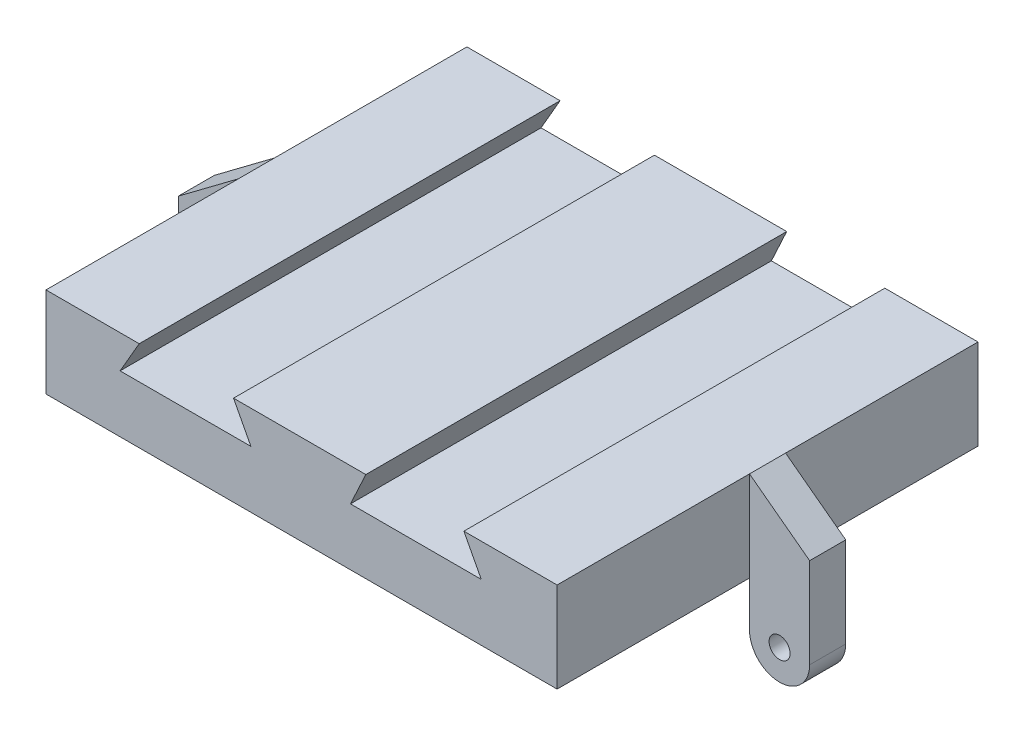
ISO-10303-21;
HEADER;
FILE_DESCRIPTION(('STEP AP214'),'2;1');
FILE_NAME('part.step','',(''),(''),'','','');
FILE_SCHEMA(('AUTOMOTIVE_DESIGN { 1 0 10303 214 1 1 1 1 }'));
ENDSEC;
DATA;
#1=APPLICATION_CONTEXT('core data for automotive mechanical design processes');
#2=APPLICATION_PROTOCOL_DEFINITION('international standard','automotive_design',2000,#1);
#3=PRODUCT_CONTEXT('',#1,'mechanical');
#4=PRODUCT('Part','Part','',(#3));
#5=PRODUCT_RELATED_PRODUCT_CATEGORY('part','',(#4));
#6=PRODUCT_DEFINITION_FORMATION('','',#4);
#7=PRODUCT_DEFINITION_CONTEXT('part definition',#1,'design');
#8=PRODUCT_DEFINITION('design','',#6,#7);
#9=PRODUCT_DEFINITION_SHAPE('','',#8);
#10=(LENGTH_UNIT() NAMED_UNIT(*) SI_UNIT(.MILLI.,.METRE.));
#11=(NAMED_UNIT(*) PLANE_ANGLE_UNIT() SI_UNIT($,.RADIAN.));
#12=(NAMED_UNIT(*) SI_UNIT($,.STERADIAN.) SOLID_ANGLE_UNIT());
#13=UNCERTAINTY_MEASURE_WITH_UNIT(LENGTH_MEASURE(1.E-05),#10,'distance_accuracy_value','');
#14=(GEOMETRIC_REPRESENTATION_CONTEXT(3) GLOBAL_UNCERTAINTY_ASSIGNED_CONTEXT((#13)) GLOBAL_UNIT_ASSIGNED_CONTEXT((#10,
#11,#12)) REPRESENTATION_CONTEXT('',''));
#15=CARTESIAN_POINT('',(0.,0.,0.));
#16=DIRECTION('',(0.,0.,1.));
#17=DIRECTION('',(1.,0.,0.));
#18=AXIS2_PLACEMENT_3D('',#15,#16,#17);
#19=CARTESIAN_POINT('',(49.41616422386,-1.305310773114,38.));
#20=DIRECTION('',(1.,0.,0.));
#21=DIRECTION('',(0.,0.,-1.));
#22=AXIS2_PLACEMENT_3D('',#19,#20,#21);
#23=PLANE('',#22);
#24=DIRECTION('',(0.,1.,0.));
#25=VECTOR('',#24,1.);
#26=CARTESIAN_POINT('',(49.41616422386,-16.30531077311,38.));
#27=LINE('',#26,#25);
#28=CARTESIAN_POINT('',(49.41616422386,-1.305310773114,38.));
#29=VERTEX_POINT('',#28);
#30=CARTESIAN_POINT('',(49.41616422386,-16.30531077311,38.));
#31=VERTEX_POINT('',#30);
#32=EDGE_CURVE('E119',#29,#31,#27,.F.);
#33=ORIENTED_EDGE('',*,*,#32,.T.);
#34=DIRECTION('',(0.,0.,-1.));
#35=VECTOR('',#34,1.);
#36=CARTESIAN_POINT('',(49.41616422386,-16.30531077311,38.));
#37=LINE('',#36,#35);
#38=CARTESIAN_POINT('',(49.41616422386,-16.30531077311,32.));
#39=VERTEX_POINT('',#38);
#40=EDGE_CURVE('E104',#39,#31,#37,.F.);
#41=ORIENTED_EDGE('',*,*,#40,.F.);
#42=DIRECTION('',(0.,1.,0.));
#43=VECTOR('',#42,1.);
#44=CARTESIAN_POINT('',(49.41616422386,-16.30531077311,32.));
#45=LINE('',#44,#43);
#46=CARTESIAN_POINT('',(49.41616422386,-1.305310773114,32.));
#47=VERTEX_POINT('',#46);
#48=EDGE_CURVE('E211',#47,#39,#45,.F.);
#49=ORIENTED_EDGE('',*,*,#48,.F.);
#50=DIRECTION('',(0.,0.,1.));
#51=VECTOR('',#50,1.);
#52=CARTESIAN_POINT('',(49.41616422386,-1.305310773114,38.));
#53=LINE('',#52,#51);
#54=EDGE_CURVE('E124',#29,#47,#53,.F.);
#55=ORIENTED_EDGE('',*,*,#54,.F.);
#56=EDGE_LOOP('',(#33,#41,#49,#55));
#57=FACE_BOUND('',#56,.T.);
#58=ADVANCED_FACE('F15',(#57),#23,.T.);
#59=CARTESIAN_POINT('',(44.41616422386,-16.30531077311,38.));
#60=DIRECTION('',(0.,0.,-1.));
#61=DIRECTION('',(-1.,0.,0.));
#62=AXIS2_PLACEMENT_3D('',#59,#60,#61);
#63=CYLINDRICAL_SURFACE('',#62,1.75);
#64=CARTESIAN_POINT('',(44.41616422386,-16.30531077311,32.));
#65=DIRECTION('',(0.,0.,-1.));
#66=DIRECTION('',(-1.,0.,0.));
#67=AXIS2_PLACEMENT_3D('',#64,#65,#66);
#68=CIRCLE('',#67,1.75);
#69=CARTESIAN_POINT('',(42.66616422386,-16.30531077311,32.));
#70=VERTEX_POINT('',#69);
#71=EDGE_CURVE('E255',#70,#70,#68,.F.);
#72=ORIENTED_EDGE('',*,*,#71,.F.);
#73=EDGE_LOOP('',(#72));
#74=FACE_BOUND('',#73,.T.);
#75=CARTESIAN_POINT('',(44.41616422386,-16.30531077311,38.));
#76=DIRECTION('',(0.,0.,-1.));
#77=DIRECTION('',(-1.,0.,0.));
#78=AXIS2_PLACEMENT_3D('',#75,#76,#77);
#79=CIRCLE('',#78,1.75);
#80=CARTESIAN_POINT('',(42.66616422386,-16.30531077311,38.));
#81=VERTEX_POINT('',#80);
#82=EDGE_CURVE('E123',#81,#81,#79,.F.);
#83=ORIENTED_EDGE('',*,*,#82,.T.);
#84=EDGE_LOOP('',(#83));
#85=FACE_BOUND('',#84,.T.);
#86=ADVANCED_FACE('F262',(#74,#85),#63,.F.);
#87=CARTESIAN_POINT('',(49.41616422386,-1.305310773114,38.));
#88=DIRECTION('',(0.6,0.8,0.));
#89=DIRECTION('',(-0.8,0.6,0.));
#90=AXIS2_PLACEMENT_3D('',#87,#88,#89);
#91=PLANE('',#90);
#92=DIRECTION('',(0.800000000000038,-0.599999999999949,0.));
#93=VECTOR('',#92,1.);
#94=CARTESIAN_POINT('',(39.41616422386,6.194689226885,32.));
#95=LINE('',#94,#93);
#96=CARTESIAN_POINT('',(39.41616422386,6.194689226885,32.));
#97=VERTEX_POINT('',#96);
#98=EDGE_CURVE('E208',#97,#47,#95,.T.);
#99=ORIENTED_EDGE('',*,*,#98,.F.);
#100=DIRECTION('',(0.,0.,-1.));
#101=VECTOR('',#100,1.);
#102=CARTESIAN_POINT('',(39.41616422386,6.194689226885,70.));
#103=LINE('',#102,#101);
#104=CARTESIAN_POINT('',(39.41616422386,6.194689226885,38.));
#105=VERTEX_POINT('',#104);
#106=EDGE_CURVE('E176',#97,#105,#103,.F.);
#107=ORIENTED_EDGE('',*,*,#106,.T.);
#108=DIRECTION('',(0.800000000000038,-0.599999999999949,0.));
#109=VECTOR('',#108,1.);
#110=CARTESIAN_POINT('',(39.41616422386,6.194689226885,38.));
#111=LINE('',#110,#109);
#112=EDGE_CURVE('E113',#105,#29,#111,.T.);
#113=ORIENTED_EDGE('',*,*,#112,.T.);
#114=ORIENTED_EDGE('',*,*,#54,.T.);
#115=EDGE_LOOP('',(#99,#107,#113,#114));
#116=FACE_BOUND('',#115,.T.);
#117=ADVANCED_FACE('F499',(#116),#91,.T.);
#118=CARTESIAN_POINT('',(-55.58383577614,-1.305310773114,38.));
#119=DIRECTION('',(-1.,0.,0.));
#120=DIRECTION('',(0.,0.,1.));
#121=AXIS2_PLACEMENT_3D('',#118,#119,#120);
#122=PLANE('',#121);
#123=DIRECTION('',(0.,1.,0.));
#124=VECTOR('',#123,1.);
#125=CARTESIAN_POINT('',(-55.58383577614,-16.30531077311,38.));
#126=LINE('',#125,#124);
#127=CARTESIAN_POINT('',(-55.58383577614,-16.30531077311,38.));
#128=VERTEX_POINT('',#127);
#129=CARTESIAN_POINT('',(-55.58383577614,-1.305310773114,38.));
#130=VERTEX_POINT('',#129);
#131=EDGE_CURVE('E191',#128,#130,#126,.T.);
#132=ORIENTED_EDGE('',*,*,#131,.T.);
#133=DIRECTION('',(0.,0.,1.));
#134=VECTOR('',#133,1.);
#135=CARTESIAN_POINT('',(-55.58383577614,-1.305310773114,38.));
#136=LINE('',#135,#134);
#137=CARTESIAN_POINT('',(-55.58383577614,-1.305310773114,32.));
#138=VERTEX_POINT('',#137);
#139=EDGE_CURVE('E114',#138,#130,#136,.T.);
#140=ORIENTED_EDGE('',*,*,#139,.F.);
#141=DIRECTION('',(0.,1.,0.));
#142=VECTOR('',#141,1.);
#143=CARTESIAN_POINT('',(-55.58383577614,-16.30531077311,32.));
#144=LINE('',#143,#142);
#145=CARTESIAN_POINT('',(-55.58383577614,-16.30531077311,32.));
#146=VERTEX_POINT('',#145);
#147=EDGE_CURVE('E250',#146,#138,#144,.T.);
#148=ORIENTED_EDGE('',*,*,#147,.F.);
#149=DIRECTION('',(0.,0.,-1.));
#150=VECTOR('',#149,1.);
#151=CARTESIAN_POINT('',(-55.58383577614,-16.30531077311,38.));
#152=LINE('',#151,#150);
#153=EDGE_CURVE('E204',#128,#146,#152,.T.);
#154=ORIENTED_EDGE('',*,*,#153,.F.);
#155=EDGE_LOOP('',(#132,#140,#148,#154));
#156=FACE_BOUND('',#155,.T.);
#157=ADVANCED_FACE('F631',(#156),#122,.T.);
#158=CARTESIAN_POINT('',(-55.58383577614,-1.305310773114,38.));
#159=DIRECTION('',(-0.6,0.8,0.));
#160=DIRECTION('',(-0.8,-0.6,0.));
#161=AXIS2_PLACEMENT_3D('',#158,#159,#160);
#162=PLANE('',#161);
#163=DIRECTION('',(0.8,0.6,0.));
#164=VECTOR('',#163,1.);
#165=CARTESIAN_POINT('',(-55.58383577614,-1.305310773114,38.));
#166=LINE('',#165,#164);
#167=CARTESIAN_POINT('',(-45.5838357761401,6.1946892268857,38.));
#168=VERTEX_POINT('',#167);
#169=EDGE_CURVE('E187',#130,#168,#166,.T.);
#170=ORIENTED_EDGE('',*,*,#169,.T.);
#171=DIRECTION('',(0.,0.,-1.));
#172=VECTOR('',#171,1.);
#173=CARTESIAN_POINT('',(-45.58383577614,6.194689226885,70.));
#174=LINE('',#173,#172);
#175=CARTESIAN_POINT('',(-45.5838357761401,6.19468922688516,32.));
#176=VERTEX_POINT('',#175);
#177=EDGE_CURVE('E466',#168,#176,#174,.T.);
#178=ORIENTED_EDGE('',*,*,#177,.T.);
#179=DIRECTION('',(0.8,0.6,0.));
#180=VECTOR('',#179,1.);
#181=CARTESIAN_POINT('',(-55.58383577614,-1.305310773114,32.));
#182=LINE('',#181,#180);
#183=EDGE_CURVE('E247',#138,#176,#182,.T.);
#184=ORIENTED_EDGE('',*,*,#183,.F.);
#185=ORIENTED_EDGE('',*,*,#139,.T.);
#186=EDGE_LOOP('',(#170,#178,#184,#185));
#187=FACE_BOUND('',#186,.T.);
#188=ADVANCED_FACE('F571',(#187),#162,.T.);
#189=CARTESIAN_POINT('',(-50.58383577614,-16.30531077311,38.));
#190=DIRECTION('',(0.,0.,-1.));
#191=DIRECTION('',(-1.,0.,0.));
#192=AXIS2_PLACEMENT_3D('',#189,#190,#191);
#193=CYLINDRICAL_SURFACE('',#192,1.75);
#194=CARTESIAN_POINT('',(-50.58383577614,-16.30531077311,32.));
#195=DIRECTION('',(0.,0.,-1.));
#196=DIRECTION('',(-1.,0.,0.));
#197=AXIS2_PLACEMENT_3D('',#194,#195,#196);
#198=CIRCLE('',#197,1.75);
#199=CARTESIAN_POINT('',(-52.33383577614,-16.30531077311,32.));
#200=VERTEX_POINT('',#199);
#201=EDGE_CURVE('E244',#200,#200,#198,.F.);
#202=ORIENTED_EDGE('',*,*,#201,.F.);
#203=EDGE_LOOP('',(#202));
#204=FACE_BOUND('',#203,.T.);
#205=CARTESIAN_POINT('',(-50.58383577614,-16.30531077311,38.));
#206=DIRECTION('',(0.,0.,-1.));
#207=DIRECTION('',(-1.,0.,0.));
#208=AXIS2_PLACEMENT_3D('',#205,#206,#207);
#209=CIRCLE('',#208,1.75);
#210=CARTESIAN_POINT('',(-52.33383577614,-16.30531077311,38.));
#211=VERTEX_POINT('',#210);
#212=EDGE_CURVE('E190',#211,#211,#209,.F.);
#213=ORIENTED_EDGE('',*,*,#212,.T.);
#214=EDGE_LOOP('',(#213));
#215=FACE_BOUND('',#214,.T.);
#216=ADVANCED_FACE('F275',(#204,#215),#193,.F.);
#217=CARTESIAN_POINT('',(44.41616422386,-16.30531077311,38.));
#218=DIRECTION('',(0.,0.,-1.));
#219=DIRECTION('',(-1.,0.,0.));
#220=AXIS2_PLACEMENT_3D('',#217,#218,#219);
#221=CYLINDRICAL_SURFACE('',#220,5.);
#222=CARTESIAN_POINT('',(44.41616422386,-16.30531077311,38.));
#223=DIRECTION('',(0.,0.,-1.));
#224=DIRECTION('',(-1.,0.,0.));
#225=AXIS2_PLACEMENT_3D('',#222,#223,#224);
#226=CIRCLE('',#225,5.);
#227=CARTESIAN_POINT('',(39.41616422386,-16.30531077311,38.));
#228=VERTEX_POINT('',#227);
#229=EDGE_CURVE('E18',#31,#228,#226,.T.);
#230=ORIENTED_EDGE('',*,*,#229,.T.);
#231=DIRECTION('',(0.,0.,1.));
#232=VECTOR('',#231,1.);
#233=CARTESIAN_POINT('',(39.41616422386,-16.30531077311,38.));
#234=LINE('',#233,#232);
#235=CARTESIAN_POINT('',(39.41616422386,-16.30531077311,32.));
#236=VERTEX_POINT('',#235);
#237=EDGE_CURVE('E133',#236,#228,#234,.T.);
#238=ORIENTED_EDGE('',*,*,#237,.F.);
#239=CARTESIAN_POINT('',(44.41616422386,-16.30531077311,32.));
#240=DIRECTION('',(0.,0.,-1.));
#241=DIRECTION('',(-1.,0.,0.));
#242=AXIS2_PLACEMENT_3D('',#239,#240,#241);
#243=CIRCLE('',#242,5.);
#244=EDGE_CURVE('E109',#39,#236,#243,.T.);
#245=ORIENTED_EDGE('',*,*,#244,.F.);
#246=ORIENTED_EDGE('',*,*,#40,.T.);
#247=EDGE_LOOP('',(#230,#238,#245,#246));
#248=FACE_BOUND('',#247,.T.);
#249=ADVANCED_FACE('F106',(#248),#221,.T.);
#250=CARTESIAN_POINT('',(44.41616422386,-16.30531077311,38.));
#251=DIRECTION('',(0.,0.,-1.));
#252=DIRECTION('',(-1.,0.,0.));
#253=AXIS2_PLACEMENT_3D('',#250,#251,#252);
#254=PLANE('',#253);
#255=ORIENTED_EDGE('',*,*,#82,.F.);
#256=EDGE_LOOP('',(#255));
#257=FACE_BOUND('',#256,.T.);
#258=DIRECTION('',(0.,1.,0.));
#259=VECTOR('',#258,1.);
#260=CARTESIAN_POINT('',(39.41616422386,-1.305310773114,38.));
#261=LINE('',#260,#259);
#262=CARTESIAN_POINT('',(39.41616422386,-8.805310773115,38.));
#263=VERTEX_POINT('',#262);
#264=EDGE_CURVE('E122',#228,#263,#261,.T.);
#265=ORIENTED_EDGE('',*,*,#264,.F.);
#266=ORIENTED_EDGE('',*,*,#229,.F.);
#267=ORIENTED_EDGE('',*,*,#32,.F.);
#268=ORIENTED_EDGE('',*,*,#112,.F.);
#269=DIRECTION('',(0.,1.,0.));
#270=VECTOR('',#269,1.);
#271=CARTESIAN_POINT('',(39.41616422386,-8.805310773115,38.));
#272=LINE('',#271,#270);
#273=EDGE_CURVE('E141',#105,#263,#272,.F.);
#274=ORIENTED_EDGE('',*,*,#273,.T.);
#275=EDGE_LOOP('',(#265,#266,#267,#268,#274));
#276=FACE_BOUND('',#275,.T.);
#277=ADVANCED_FACE('F118',(#257,#276),#254,.F.);
#278=CARTESIAN_POINT('',(44.41616422386,-16.30531077311,32.));
#279=DIRECTION('',(0.,0.,-1.));
#280=DIRECTION('',(-1.,0.,0.));
#281=AXIS2_PLACEMENT_3D('',#278,#279,#280);
#282=PLANE('',#281);
#283=ORIENTED_EDGE('',*,*,#71,.T.);
#284=EDGE_LOOP('',(#283));
#285=FACE_BOUND('',#284,.T.);
#286=ORIENTED_EDGE('',*,*,#244,.T.);
#287=DIRECTION('',(0.,1.,0.));
#288=VECTOR('',#287,1.);
#289=CARTESIAN_POINT('',(39.41616422386,-1.305310773114,32.));
#290=LINE('',#289,#288);
#291=CARTESIAN_POINT('',(39.41616422386,-8.805310773115,32.));
#292=VERTEX_POINT('',#291);
#293=EDGE_CURVE('E136',#292,#236,#290,.F.);
#294=ORIENTED_EDGE('',*,*,#293,.F.);
#295=DIRECTION('',(0.,1.,0.));
#296=VECTOR('',#295,1.);
#297=CARTESIAN_POINT('',(39.41616422386,-8.805310773115,32.));
#298=LINE('',#297,#296);
#299=EDGE_CURVE('E138',#292,#97,#298,.T.);
#300=ORIENTED_EDGE('',*,*,#299,.T.);
#301=ORIENTED_EDGE('',*,*,#98,.T.);
#302=ORIENTED_EDGE('',*,*,#48,.T.);
#303=EDGE_LOOP('',(#286,#294,#300,#301,#302));
#304=FACE_BOUND('',#303,.T.);
#305=ADVANCED_FACE('F265',(#285,#304),#282,.T.);
#306=CARTESIAN_POINT('',(-30.08383577614,6.194689226885,70.));
#307=DIRECTION('',(-0.866025403784429,0.500000000000017,0.));
#308=DIRECTION('',(-0.500000000000017,-0.866025403784429,0.));
#309=AXIS2_PLACEMENT_3D('',#306,#307,#308);
#310=PLANE('',#309);
#311=DIRECTION('',(-0.500000000000861,-0.866025403783942,0.));
#312=VECTOR('',#311,1.);
#313=CARTESIAN_POINT('',(-30.08383577614,6.194689226885,70.));
#314=LINE('',#313,#312);
#315=CARTESIAN_POINT('',(-30.08383577614,6.194689226885,70.));
#316=VERTEX_POINT('',#315);
#317=CARTESIAN_POINT('',(-33.2592622566873,0.694689226883853,70.));
#318=VERTEX_POINT('',#317);
#319=EDGE_CURVE('E402',#316,#318,#314,.T.);
#320=ORIENTED_EDGE('',*,*,#319,.T.);
#321=DIRECTION('',(0.,0.,-1.));
#322=VECTOR('',#321,1.);
#323=CARTESIAN_POINT('',(-33.25926225669,0.6946892268854,70.));
#324=LINE('',#323,#322);
#325=CARTESIAN_POINT('',(-33.2592622566873,0.694689226883853,0.));
#326=VERTEX_POINT('',#325);
#327=EDGE_CURVE('E258',#318,#326,#324,.T.);
#328=ORIENTED_EDGE('',*,*,#327,.T.);
#329=DIRECTION('',(-0.500000000000861,-0.866025403783942,0.));
#330=VECTOR('',#329,1.);
#331=CARTESIAN_POINT('',(-30.08383577614,6.194689226885,0.));
#332=LINE('',#331,#330);
#333=CARTESIAN_POINT('',(-30.08383577614,6.194689226885,0.));
#334=VERTEX_POINT('',#333);
#335=EDGE_CURVE('E574',#334,#326,#332,.T.);
#336=ORIENTED_EDGE('',*,*,#335,.F.);
#337=DIRECTION('',(0.,0.,-1.));
#338=VECTOR('',#337,1.);
#339=CARTESIAN_POINT('',(-30.08383577614,6.194689226885,70.));
#340=LINE('',#339,#338);
#341=EDGE_CURVE('E409',#334,#316,#340,.F.);
#342=ORIENTED_EDGE('',*,*,#341,.T.);
#343=EDGE_LOOP('',(#320,#328,#336,#342));
#344=FACE_BOUND('',#343,.T.);
#345=ADVANCED_FACE('F272',(#344),#310,.F.);
#346=CARTESIAN_POINT('',(-33.25926225669,0.6946892268854,70.));
#347=DIRECTION('',(0.,-1.,0.));
#348=DIRECTION('',(0.,0.,-1.));
#349=AXIS2_PLACEMENT_3D('',#346,#347,#348);
#350=PLANE('',#349);
#351=DIRECTION('',(-1.,0.,0.));
#352=VECTOR('',#351,1.);
#353=CARTESIAN_POINT('',(0.,0.6946892268854,70.));
#354=LINE('',#353,#352);
#355=CARTESIAN_POINT('',(-11.50926225669,0.6946892268854,70.));
#356=VERTEX_POINT('',#355);
#357=EDGE_CURVE('E415',#318,#356,#354,.F.);
#358=ORIENTED_EDGE('',*,*,#357,.T.);
#359=DIRECTION('',(0.,0.,1.));
#360=VECTOR('',#359,1.);
#361=CARTESIAN_POINT('',(-11.50926225669,0.6946892268854,70.));
#362=LINE('',#361,#360);
#363=CARTESIAN_POINT('',(-11.50926225669,0.6946892268854,0.));
#364=VERTEX_POINT('',#363);
#365=EDGE_CURVE('E491',#356,#364,#362,.F.);
#366=ORIENTED_EDGE('',*,*,#365,.T.);
#367=DIRECTION('',(-1.,0.,0.));
#368=VECTOR('',#367,1.);
#369=CARTESIAN_POINT('',(0.,0.6946892268854,0.));
#370=LINE('',#369,#368);
#371=EDGE_CURVE('E576',#326,#364,#370,.F.);
#372=ORIENTED_EDGE('',*,*,#371,.F.);
#373=ORIENTED_EDGE('',*,*,#327,.F.);
#374=EDGE_LOOP('',(#358,#366,#372,#373));
#375=FACE_BOUND('',#374,.T.);
#376=ADVANCED_FACE('F388',(#375),#350,.F.);
#377=CARTESIAN_POINT('',(-11.50926225669,0.6946892268854,70.));
#378=DIRECTION('',(0.885447501898144,0.464739412340223,0.));
#379=DIRECTION('',(-0.464739412340223,0.885447501898144,0.));
#380=AXIS2_PLACEMENT_3D('',#377,#378,#379);
#381=PLANE('',#380);
#382=DIRECTION('',(-0.464739412339173,0.885447501898695,0.));
#383=VECTOR('',#382,1.);
#384=CARTESIAN_POINT('',(-11.50926225669,0.6946892268854,70.));
#385=LINE('',#384,#383);
#386=CARTESIAN_POINT('',(-14.3960136026333,6.19468922688329,70.));
#387=VERTEX_POINT('',#386);
#388=EDGE_CURVE('E419',#356,#387,#385,.T.);
#389=ORIENTED_EDGE('',*,*,#388,.T.);
#390=DIRECTION('',(0.,0.,-1.));
#391=VECTOR('',#390,1.);
#392=CARTESIAN_POINT('',(-14.39601360263,6.194689226885,70.));
#393=LINE('',#392,#391);
#394=CARTESIAN_POINT('',(-14.3960136026333,6.19468922688329,0.));
#395=VERTEX_POINT('',#394);
#396=EDGE_CURVE('E488',#387,#395,#393,.T.);
#397=ORIENTED_EDGE('',*,*,#396,.T.);
#398=DIRECTION('',(-0.464739412339173,0.885447501898695,0.));
#399=VECTOR('',#398,1.);
#400=CARTESIAN_POINT('',(-11.50926225669,0.6946892268854,0.));
#401=LINE('',#400,#399);
#402=EDGE_CURVE('E599',#364,#395,#401,.T.);
#403=ORIENTED_EDGE('',*,*,#402,.F.);
#404=ORIENTED_EDGE('',*,*,#365,.F.);
#405=EDGE_LOOP('',(#389,#397,#403,#404));
#406=FACE_BOUND('',#405,.T.);
#407=ADVANCED_FACE('F384',(#406),#381,.F.);
#408=CARTESIAN_POINT('',(-14.39601360263,6.194689226885,70.));
#409=DIRECTION('',(0.,-1.,0.));
#410=DIRECTION('',(0.,0.,-1.));
#411=AXIS2_PLACEMENT_3D('',#408,#409,#410);
#412=PLANE('',#411);
#413=DIRECTION('',(-1.,0.,0.));
#414=VECTOR('',#413,1.);
#415=CARTESIAN_POINT('',(0.,6.194689226885,70.));
#416=LINE('',#415,#414);
#417=CARTESIAN_POINT('',(7.60398639736491,6.19468922688504,70.));
#418=VERTEX_POINT('',#417);
#419=EDGE_CURVE('E591',#387,#418,#416,.F.);
#420=ORIENTED_EDGE('',*,*,#419,.T.);
#421=DIRECTION('',(0.,0.,1.));
#422=VECTOR('',#421,1.);
#423=CARTESIAN_POINT('',(7.60398639736465,6.19468922688516,70.));
#424=LINE('',#423,#422);
#425=CARTESIAN_POINT('',(7.60398639736491,6.19468922688504,0.));
#426=VERTEX_POINT('',#425);
#427=EDGE_CURVE('E485',#418,#426,#424,.F.);
#428=ORIENTED_EDGE('',*,*,#427,.T.);
#429=DIRECTION('',(-1.,0.,0.));
#430=VECTOR('',#429,1.);
#431=CARTESIAN_POINT('',(0.,6.194689226885,0.));
#432=LINE('',#431,#430);
#433=EDGE_CURVE('E600',#395,#426,#432,.F.);
#434=ORIENTED_EDGE('',*,*,#433,.F.);
#435=ORIENTED_EDGE('',*,*,#396,.F.);
#436=EDGE_LOOP('',(#420,#428,#434,#435));
#437=FACE_BOUND('',#436,.T.);
#438=ADVANCED_FACE('F380',(#437),#412,.F.);
#439=CARTESIAN_POINT('',(5.052915569805,0.6946892268854,70.));
#440=DIRECTION('',(-0.907166439323588,0.420771970745394,0.));
#441=DIRECTION('',(-0.420771970745394,-0.907166439323588,0.));
#442=AXIS2_PLACEMENT_3D('',#439,#440,#441);
#443=PLANE('',#442);
#444=DIRECTION('',(-0.420771970745452,-0.907166439323561,0.));
#445=VECTOR('',#444,1.);
#446=CARTESIAN_POINT('',(7.603986397365,6.194689226885,70.));
#447=LINE('',#446,#445);
#448=CARTESIAN_POINT('',(5.052915569805,0.6946892268854,70.));
#449=VERTEX_POINT('',#448);
#450=EDGE_CURVE('E588',#418,#449,#447,.T.);
#451=ORIENTED_EDGE('',*,*,#450,.T.);
#452=DIRECTION('',(0.,0.,-1.));
#453=VECTOR('',#452,1.);
#454=CARTESIAN_POINT('',(5.052915569805,0.6946892268854,70.));
#455=LINE('',#454,#453);
#456=CARTESIAN_POINT('',(5.052915569805,0.6946892268854,0.));
#457=VERTEX_POINT('',#456);
#458=EDGE_CURVE('E482',#449,#457,#455,.T.);
#459=ORIENTED_EDGE('',*,*,#458,.T.);
#460=DIRECTION('',(-0.420771970745452,-0.907166439323561,0.));
#461=VECTOR('',#460,1.);
#462=CARTESIAN_POINT('',(7.603986397365,6.194689226885,0.));
#463=LINE('',#462,#461);
#464=EDGE_CURVE('E604',#426,#457,#463,.T.);
#465=ORIENTED_EDGE('',*,*,#464,.F.);
#466=ORIENTED_EDGE('',*,*,#427,.F.);
#467=EDGE_LOOP('',(#451,#459,#465,#466));
#468=FACE_BOUND('',#467,.T.);
#469=ADVANCED_FACE('F376',(#468),#443,.F.);
#470=CARTESIAN_POINT('',(-33.25926225669,0.6946892268854,70.));
#471=DIRECTION('',(0.,-1.,0.));
#472=DIRECTION('',(0.,0.,-1.));
#473=AXIS2_PLACEMENT_3D('',#470,#471,#472);
#474=PLANE('',#473);
#475=DIRECTION('',(-1.,0.,0.));
#476=VECTOR('',#475,1.);
#477=CARTESIAN_POINT('',(0.,0.6946892268854,70.));
#478=LINE('',#477,#476);
#479=CARTESIAN_POINT('',(26.8029155698097,0.694689226885227,70.));
#480=VERTEX_POINT('',#479);
#481=EDGE_CURVE('E585',#449,#480,#478,.F.);
#482=ORIENTED_EDGE('',*,*,#481,.T.);
#483=DIRECTION('',(0.,0.,1.));
#484=VECTOR('',#483,1.);
#485=CARTESIAN_POINT('',(26.8029155698087,0.694689226884707,70.));
#486=LINE('',#485,#484);
#487=CARTESIAN_POINT('',(26.8029155698097,0.694689226885227,0.));
#488=VERTEX_POINT('',#487);
#489=EDGE_CURVE('E180',#480,#488,#486,.F.);
#490=ORIENTED_EDGE('',*,*,#489,.T.);
#491=DIRECTION('',(-1.,0.,0.));
#492=VECTOR('',#491,1.);
#493=CARTESIAN_POINT('',(0.,0.6946892268854,0.));
#494=LINE('',#493,#492);
#495=EDGE_CURVE('E606',#457,#488,#494,.F.);
#496=ORIENTED_EDGE('',*,*,#495,.F.);
#497=ORIENTED_EDGE('',*,*,#458,.F.);
#498=EDGE_LOOP('',(#482,#490,#496,#497));
#499=FACE_BOUND('',#498,.T.);
#500=ADVANCED_FACE('F372',(#499),#474,.F.);
#501=CARTESIAN_POINT('',(23.91616422386,6.194689226885,70.));
#502=DIRECTION('',(0.885447501898144,0.464739412340223,0.));
#503=DIRECTION('',(-0.464739412340223,0.885447501898144,0.));
#504=AXIS2_PLACEMENT_3D('',#501,#502,#503);
#505=PLANE('',#504);
#506=DIRECTION('',(-0.464739412340436,0.885447501898033,0.));
#507=VECTOR('',#506,1.);
#508=CARTESIAN_POINT('',(26.80291556981,0.6946892268854,70.));
#509=LINE('',#508,#507);
#510=CARTESIAN_POINT('',(23.91616422386,6.194689226885,70.));
#511=VERTEX_POINT('',#510);
#512=EDGE_CURVE('E582',#480,#511,#509,.T.);
#513=ORIENTED_EDGE('',*,*,#512,.T.);
#514=DIRECTION('',(0.,0.,-1.));
#515=VECTOR('',#514,1.);
#516=CARTESIAN_POINT('',(23.91616422386,6.194689226885,70.));
#517=LINE('',#516,#515);
#518=CARTESIAN_POINT('',(23.91616422386,6.194689226885,0.));
#519=VERTEX_POINT('',#518);
#520=EDGE_CURVE('E179',#511,#519,#517,.T.);
#521=ORIENTED_EDGE('',*,*,#520,.T.);
#522=DIRECTION('',(-0.464739412340436,0.885447501898033,0.));
#523=VECTOR('',#522,1.);
#524=CARTESIAN_POINT('',(26.80291556981,0.6946892268854,0.));
#525=LINE('',#524,#523);
#526=EDGE_CURVE('E608',#488,#519,#525,.T.);
#527=ORIENTED_EDGE('',*,*,#526,.F.);
#528=ORIENTED_EDGE('',*,*,#489,.F.);
#529=EDGE_LOOP('',(#513,#521,#527,#528));
#530=FACE_BOUND('',#529,.T.);
#531=ADVANCED_FACE('F368',(#530),#505,.F.);
#532=CARTESIAN_POINT('',(39.41616422386,6.194689226885,70.));
#533=DIRECTION('',(0.,-1.,0.));
#534=DIRECTION('',(0.,0.,-1.));
#535=AXIS2_PLACEMENT_3D('',#532,#533,#534);
#536=PLANE('',#535);
#537=DIRECTION('',(-1.,0.,0.));
#538=VECTOR('',#537,1.);
#539=CARTESIAN_POINT('',(0.,6.194689226885,0.));
#540=LINE('',#539,#538);
#541=CARTESIAN_POINT('',(39.41616422386,6.194689226885,0.));
#542=VERTEX_POINT('',#541);
#543=EDGE_CURVE('E506',#519,#542,#540,.F.);
#544=ORIENTED_EDGE('',*,*,#543,.F.);
#545=ORIENTED_EDGE('',*,*,#520,.F.);
#546=DIRECTION('',(-1.,0.,0.));
#547=VECTOR('',#546,1.);
#548=CARTESIAN_POINT('',(0.,6.194689226885,70.));
#549=LINE('',#548,#547);
#550=CARTESIAN_POINT('',(39.41616422386,6.194689226885,70.));
#551=VERTEX_POINT('',#550);
#552=EDGE_CURVE('E144',#511,#551,#549,.F.);
#553=ORIENTED_EDGE('',*,*,#552,.T.);
#554=DIRECTION('',(0.,0.,1.));
#555=VECTOR('',#554,1.);
#556=CARTESIAN_POINT('',(39.41616422386,6.194689226885,70.));
#557=LINE('',#556,#555);
#558=EDGE_CURVE('E161',#551,#105,#557,.F.);
#559=ORIENTED_EDGE('',*,*,#558,.T.);
#560=ORIENTED_EDGE('',*,*,#106,.F.);
#561=DIRECTION('',(0.,0.,1.));
#562=VECTOR('',#561,1.);
#563=CARTESIAN_POINT('',(39.41616422386,6.194689226885,70.));
#564=LINE('',#563,#562);
#565=EDGE_CURVE('E166',#97,#542,#564,.F.);
#566=ORIENTED_EDGE('',*,*,#565,.T.);
#567=EDGE_LOOP('',(#544,#545,#553,#559,#560,#566));
#568=FACE_BOUND('',#567,.T.);
#569=ADVANCED_FACE('F364',(#568),#536,.F.);
#570=CARTESIAN_POINT('',(-45.58383577614,6.194689226885,70.));
#571=DIRECTION('',(0.,-1.,0.));
#572=DIRECTION('',(0.,0.,-1.));
#573=AXIS2_PLACEMENT_3D('',#570,#571,#572);
#574=PLANE('',#573);
#575=DIRECTION('',(-1.,0.,0.));
#576=VECTOR('',#575,1.);
#577=CARTESIAN_POINT('',(0.,6.194689226885,70.));
#578=LINE('',#577,#576);
#579=CARTESIAN_POINT('',(-45.58383577614,6.1946892268855,70.));
#580=VERTEX_POINT('',#579);
#581=EDGE_CURVE('E416',#580,#316,#578,.F.);
#582=ORIENTED_EDGE('',*,*,#581,.T.);
#583=ORIENTED_EDGE('',*,*,#341,.F.);
#584=DIRECTION('',(-1.,0.,0.));
#585=VECTOR('',#584,1.);
#586=CARTESIAN_POINT('',(0.,6.194689226885,0.));
#587=LINE('',#586,#585);
#588=CARTESIAN_POINT('',(-45.58383577614,6.194689226885,0.));
#589=VERTEX_POINT('',#588);
#590=EDGE_CURVE('E216',#589,#334,#587,.F.);
#591=ORIENTED_EDGE('',*,*,#590,.F.);
#592=DIRECTION('',(0.,0.,-1.));
#593=VECTOR('',#592,1.);
#594=CARTESIAN_POINT('',(-45.58383577614,6.194689226885,70.));
#595=LINE('',#594,#593);
#596=EDGE_CURVE('E450',#589,#176,#595,.F.);
#597=ORIENTED_EDGE('',*,*,#596,.T.);
#598=ORIENTED_EDGE('',*,*,#177,.F.);
#599=DIRECTION('',(0.,0.,-1.));
#600=VECTOR('',#599,1.);
#601=CARTESIAN_POINT('',(-45.58383577614,6.194689226886,70.));
#602=LINE('',#601,#600);
#603=EDGE_CURVE('E194',#168,#580,#602,.F.);
#604=ORIENTED_EDGE('',*,*,#603,.T.);
#605=EDGE_LOOP('',(#582,#583,#591,#597,#598,#604));
#606=FACE_BOUND('',#605,.T.);
#607=ADVANCED_FACE('F360',(#606),#574,.F.);
#608=CARTESIAN_POINT('',(-50.58383577614,-16.30531077311,38.));
#609=DIRECTION('',(0.,0.,-1.));
#610=DIRECTION('',(-1.,0.,0.));
#611=AXIS2_PLACEMENT_3D('',#608,#609,#610);
#612=PLANE('',#611);
#613=ORIENTED_EDGE('',*,*,#212,.F.);
#614=EDGE_LOOP('',(#613));
#615=FACE_BOUND('',#614,.T.);
#616=ORIENTED_EDGE('',*,*,#169,.F.);
#617=ORIENTED_EDGE('',*,*,#131,.F.);
#618=CARTESIAN_POINT('',(-50.58383577614,-16.30531077311,38.));
#619=DIRECTION('',(0.,0.,-1.));
#620=DIRECTION('',(-1.,0.,0.));
#621=AXIS2_PLACEMENT_3D('',#618,#619,#620);
#622=CIRCLE('',#621,5.);
#623=CARTESIAN_POINT('',(-45.58383577614,-16.30531077311,38.));
#624=VERTEX_POINT('',#623);
#625=EDGE_CURVE('E207',#624,#128,#622,.T.);
#626=ORIENTED_EDGE('',*,*,#625,.F.);
#627=DIRECTION('',(0.,1.,0.));
#628=VECTOR('',#627,1.);
#629=CARTESIAN_POINT('',(-45.58383577614,-1.305310773114,38.));
#630=LINE('',#629,#628);
#631=CARTESIAN_POINT('',(-45.58383577614,-8.805310773115,38.));
#632=VERTEX_POINT('',#631);
#633=EDGE_CURVE('E431',#632,#624,#630,.F.);
#634=ORIENTED_EDGE('',*,*,#633,.F.);
#635=DIRECTION('',(0.,1.,0.));
#636=VECTOR('',#635,1.);
#637=CARTESIAN_POINT('',(-45.58383577614,-8.805310773115,38.));
#638=LINE('',#637,#636);
#639=EDGE_CURVE('E198',#632,#168,#638,.T.);
#640=ORIENTED_EDGE('',*,*,#639,.T.);
#641=EDGE_LOOP('',(#616,#617,#626,#634,#640));
#642=FACE_BOUND('',#641,.T.);
#643=ADVANCED_FACE('F356',(#615,#642),#612,.F.);
#644=CARTESIAN_POINT('',(-50.58383577614,-16.30531077311,38.));
#645=DIRECTION('',(0.,0.,-1.));
#646=DIRECTION('',(-1.,0.,0.));
#647=AXIS2_PLACEMENT_3D('',#644,#645,#646);
#648=CYLINDRICAL_SURFACE('',#647,5.);
#649=ORIENTED_EDGE('',*,*,#625,.T.);
#650=ORIENTED_EDGE('',*,*,#153,.T.);
#651=CARTESIAN_POINT('',(-50.58383577614,-16.30531077311,32.));
#652=DIRECTION('',(0.,0.,-1.));
#653=DIRECTION('',(-1.,0.,0.));
#654=AXIS2_PLACEMENT_3D('',#651,#652,#653);
#655=CIRCLE('',#654,5.);
#656=CARTESIAN_POINT('',(-45.58383577614,-16.30531077311,32.));
#657=VERTEX_POINT('',#656);
#658=EDGE_CURVE('E206',#657,#146,#655,.T.);
#659=ORIENTED_EDGE('',*,*,#658,.F.);
#660=DIRECTION('',(0.,0.,-1.));
#661=VECTOR('',#660,1.);
#662=CARTESIAN_POINT('',(-45.58383577614,-16.30531077311,38.));
#663=LINE('',#662,#661);
#664=EDGE_CURVE('E429',#624,#657,#663,.T.);
#665=ORIENTED_EDGE('',*,*,#664,.F.);
#666=EDGE_LOOP('',(#649,#650,#659,#665));
#667=FACE_BOUND('',#666,.T.);
#668=ADVANCED_FACE('F352',(#667),#648,.T.);
#669=CARTESIAN_POINT('',(-50.58383577614,-16.30531077311,32.));
#670=DIRECTION('',(0.,0.,-1.));
#671=DIRECTION('',(-1.,0.,0.));
#672=AXIS2_PLACEMENT_3D('',#669,#670,#671);
#673=PLANE('',#672);
#674=ORIENTED_EDGE('',*,*,#201,.T.);
#675=EDGE_LOOP('',(#674));
#676=FACE_BOUND('',#675,.T.);
#677=ORIENTED_EDGE('',*,*,#147,.T.);
#678=ORIENTED_EDGE('',*,*,#183,.T.);
#679=DIRECTION('',(0.,1.,0.));
#680=VECTOR('',#679,1.);
#681=CARTESIAN_POINT('',(-45.58383577614,-8.805310773115,32.));
#682=LINE('',#681,#680);
#683=CARTESIAN_POINT('',(-45.58383577614,-8.805310773115,32.));
#684=VERTEX_POINT('',#683);
#685=EDGE_CURVE('E435',#176,#684,#682,.F.);
#686=ORIENTED_EDGE('',*,*,#685,.T.);
#687=DIRECTION('',(0.,1.,0.));
#688=VECTOR('',#687,1.);
#689=CARTESIAN_POINT('',(-45.58383577614,-1.305310773114,32.));
#690=LINE('',#689,#688);
#691=EDGE_CURVE('E33',#657,#684,#690,.T.);
#692=ORIENTED_EDGE('',*,*,#691,.F.);
#693=ORIENTED_EDGE('',*,*,#658,.T.);
#694=EDGE_LOOP('',(#677,#678,#686,#692,#693));
#695=FACE_BOUND('',#694,.T.);
#696=ADVANCED_FACE('F348',(#676,#695),#673,.T.);
#697=CARTESIAN_POINT('',(0.,0.1946892268854,0.));
#698=DIRECTION('',(0.,-1.,0.));
#699=DIRECTION('',(0.,0.,-1.));
#700=AXIS2_PLACEMENT_3D('',#697,#698,#699);
#701=PLANE('',#700);
#702=CARTESIAN_POINT('',(-21.58383577614,0.194689226885401,11.));
#703=DIRECTION('',(0.,-1.,0.));
#704=DIRECTION('',(0.,0.,-1.));
#705=AXIS2_PLACEMENT_3D('',#702,#703,#704);
#706=CIRCLE('',#705,1.45);
#707=CARTESIAN_POINT('',(-21.58383577614,0.194689226885401,9.55));
#708=VERTEX_POINT('',#707);
#709=EDGE_CURVE('E241',#708,#708,#706,.T.);
#710=ORIENTED_EDGE('',*,*,#709,.T.);
#711=EDGE_LOOP('',(#710));
#712=FACE_BOUND('',#711,.T.);
#713=ADVANCED_FACE('F344',(#712),#701,.T.);
#714=CARTESIAN_POINT('',(0.,0.1946892268854,0.));
#715=DIRECTION('',(0.,-1.,0.));
#716=DIRECTION('',(0.,0.,-1.));
#717=AXIS2_PLACEMENT_3D('',#714,#715,#716);
#718=PLANE('',#717);
#719=CARTESIAN_POINT('',(6.416164223857,0.194689226885401,11.));
#720=DIRECTION('',(0.,-1.,0.));
#721=DIRECTION('',(0.,0.,-1.));
#722=AXIS2_PLACEMENT_3D('',#719,#720,#721);
#723=CIRCLE('',#722,1.45);
#724=CARTESIAN_POINT('',(6.416164223857,0.194689226885401,9.55));
#725=VERTEX_POINT('',#724);
#726=EDGE_CURVE('E238',#725,#725,#723,.T.);
#727=ORIENTED_EDGE('',*,*,#726,.T.);
#728=EDGE_LOOP('',(#727));
#729=FACE_BOUND('',#728,.T.);
#730=ADVANCED_FACE('F340',(#729),#718,.T.);
#731=CARTESIAN_POINT('',(0.,0.1946892268854,0.));
#732=DIRECTION('',(0.,-1.,0.));
#733=DIRECTION('',(0.,0.,-1.));
#734=AXIS2_PLACEMENT_3D('',#731,#732,#733);
#735=PLANE('',#734);
#736=CARTESIAN_POINT('',(21.41616422386,0.194689226885401,61.));
#737=DIRECTION('',(0.,-1.,0.));
#738=DIRECTION('',(0.,0.,-1.));
#739=AXIS2_PLACEMENT_3D('',#736,#737,#738);
#740=CIRCLE('',#739,1.45);
#741=CARTESIAN_POINT('',(21.41616422386,0.194689226885401,59.55));
#742=VERTEX_POINT('',#741);
#743=EDGE_CURVE('E235',#742,#742,#740,.T.);
#744=ORIENTED_EDGE('',*,*,#743,.T.);
#745=EDGE_LOOP('',(#744));
#746=FACE_BOUND('',#745,.T.);
#747=ADVANCED_FACE('F336',(#746),#735,.T.);
#748=CARTESIAN_POINT('',(0.,0.1946892268854,0.));
#749=DIRECTION('',(0.,-1.,0.));
#750=DIRECTION('',(0.,0.,-1.));
#751=AXIS2_PLACEMENT_3D('',#748,#749,#750);
#752=PLANE('',#751);
#753=CARTESIAN_POINT('',(-26.58383577614,0.194689226885401,63.));
#754=DIRECTION('',(0.,-1.,0.));
#755=DIRECTION('',(0.,0.,-1.));
#756=AXIS2_PLACEMENT_3D('',#753,#754,#755);
#757=CIRCLE('',#756,1.45);
#758=CARTESIAN_POINT('',(-26.58383577614,0.194689226885401,61.55));
#759=VERTEX_POINT('',#758);
#760=EDGE_CURVE('E231',#759,#759,#757,.T.);
#761=ORIENTED_EDGE('',*,*,#760,.T.);
#762=EDGE_LOOP('',(#761));
#763=FACE_BOUND('',#762,.T.);
#764=ADVANCED_FACE('F332',(#763),#752,.T.);
#765=CARTESIAN_POINT('',(-45.58383577614,-8.805310773115,70.));
#766=DIRECTION('',(1.,0.,0.));
#767=DIRECTION('',(0.,0.,-1.));
#768=AXIS2_PLACEMENT_3D('',#765,#766,#767);
#769=PLANE('',#768);
#770=DIRECTION('',(0.,1.,0.));
#771=VECTOR('',#770,1.);
#772=CARTESIAN_POINT('',(-45.58383577614,0.,70.));
#773=LINE('',#772,#771);
#774=CARTESIAN_POINT('',(-45.58383577614,-8.805310773115,70.));
#775=VERTEX_POINT('',#774);
#776=EDGE_CURVE('E197',#775,#580,#773,.T.);
#777=ORIENTED_EDGE('',*,*,#776,.T.);
#778=ORIENTED_EDGE('',*,*,#603,.F.);
#779=ORIENTED_EDGE('',*,*,#639,.F.);
#780=DIRECTION('',(0.,0.,1.));
#781=VECTOR('',#780,1.);
#782=CARTESIAN_POINT('',(-45.58383577614,-8.805310773115,70.));
#783=LINE('',#782,#781);
#784=EDGE_CURVE('E234',#632,#775,#783,.T.);
#785=ORIENTED_EDGE('',*,*,#784,.T.);
#786=EDGE_LOOP('',(#777,#778,#779,#785));
#787=FACE_BOUND('',#786,.T.);
#788=ADVANCED_FACE('F328',(#787),#769,.F.);
#789=CARTESIAN_POINT('',(0.,0.,70.));
#790=DIRECTION('',(0.,0.,-1.));
#791=DIRECTION('',(-1.,0.,0.));
#792=AXIS2_PLACEMENT_3D('',#789,#790,#791);
#793=PLANE('',#792);
#794=DIRECTION('',(0.,1.,0.));
#795=VECTOR('',#794,1.);
#796=CARTESIAN_POINT('',(39.41616422386,-8.805310773115,70.));
#797=LINE('',#796,#795);
#798=CARTESIAN_POINT('',(39.41616422386,-8.805310773115,70.));
#799=VERTEX_POINT('',#798);
#800=EDGE_CURVE('E143',#799,#551,#797,.T.);
#801=ORIENTED_EDGE('',*,*,#800,.T.);
#802=ORIENTED_EDGE('',*,*,#552,.F.);
#803=ORIENTED_EDGE('',*,*,#512,.F.);
#804=ORIENTED_EDGE('',*,*,#481,.F.);
#805=ORIENTED_EDGE('',*,*,#450,.F.);
#806=ORIENTED_EDGE('',*,*,#419,.F.);
#807=ORIENTED_EDGE('',*,*,#388,.F.);
#808=ORIENTED_EDGE('',*,*,#357,.F.);
#809=ORIENTED_EDGE('',*,*,#319,.F.);
#810=ORIENTED_EDGE('',*,*,#581,.F.);
#811=ORIENTED_EDGE('',*,*,#776,.F.);
#812=DIRECTION('',(1.,0.,0.));
#813=VECTOR('',#812,1.);
#814=CARTESIAN_POINT('',(-45.58383577614,-8.805310773115,70.));
#815=LINE('',#814,#813);
#816=EDGE_CURVE('E156',#775,#799,#815,.T.);
#817=ORIENTED_EDGE('',*,*,#816,.T.);
#818=EDGE_LOOP('',(#801,#802,#803,#804,#805,#806,#807,#808,#809,#810,#811,#817));
#819=FACE_BOUND('',#818,.T.);
#820=ADVANCED_FACE('F324',(#819),#793,.F.);
#821=CARTESIAN_POINT('',(39.41616422386,-8.805310773115,70.));
#822=DIRECTION('',(-1.,0.,0.));
#823=DIRECTION('',(0.,0.,1.));
#824=AXIS2_PLACEMENT_3D('',#821,#822,#823);
#825=PLANE('',#824);
#826=ORIENTED_EDGE('',*,*,#800,.F.);
#827=DIRECTION('',(0.,0.,1.));
#828=VECTOR('',#827,1.);
#829=CARTESIAN_POINT('',(39.41616422386,-8.805310773115,70.));
#830=LINE('',#829,#828);
#831=EDGE_CURVE('E151',#799,#263,#830,.F.);
#832=ORIENTED_EDGE('',*,*,#831,.T.);
#833=ORIENTED_EDGE('',*,*,#273,.F.);
#834=ORIENTED_EDGE('',*,*,#558,.F.);
#835=EDGE_LOOP('',(#826,#832,#833,#834));
#836=FACE_BOUND('',#835,.T.);
#837=ADVANCED_FACE('F320',(#836),#825,.F.);
#838=CARTESIAN_POINT('',(39.41616422386,-1.305310773114,38.));
#839=DIRECTION('',(-1.,0.,0.));
#840=DIRECTION('',(0.,0.,1.));
#841=AXIS2_PLACEMENT_3D('',#838,#839,#840);
#842=PLANE('',#841);
#843=ORIENTED_EDGE('',*,*,#264,.T.);
#844=DIRECTION('',(0.,0.,1.));
#845=VECTOR('',#844,1.);
#846=CARTESIAN_POINT('',(39.41616422386,-8.805310773115,70.));
#847=LINE('',#846,#845);
#848=EDGE_CURVE('E147',#263,#292,#847,.F.);
#849=ORIENTED_EDGE('',*,*,#848,.T.);
#850=ORIENTED_EDGE('',*,*,#293,.T.);
#851=ORIENTED_EDGE('',*,*,#237,.T.);
#852=EDGE_LOOP('',(#843,#849,#850,#851));
#853=FACE_BOUND('',#852,.T.);
#854=ADVANCED_FACE('F316',(#853),#842,.T.);
#855=CARTESIAN_POINT('',(39.41616422386,-8.805310773115,70.));
#856=DIRECTION('',(-1.,0.,0.));
#857=DIRECTION('',(0.,0.,1.));
#858=AXIS2_PLACEMENT_3D('',#855,#856,#857);
#859=PLANE('',#858);
#860=DIRECTION('',(0.,1.,0.));
#861=VECTOR('',#860,1.);
#862=CARTESIAN_POINT('',(39.41616422386,0.,0.));
#863=LINE('',#862,#861);
#864=CARTESIAN_POINT('',(39.41616422386,-8.805310773115,0.));
#865=VERTEX_POINT('',#864);
#866=EDGE_CURVE('E438',#542,#865,#863,.F.);
#867=ORIENTED_EDGE('',*,*,#866,.F.);
#868=ORIENTED_EDGE('',*,*,#565,.F.);
#869=ORIENTED_EDGE('',*,*,#299,.F.);
#870=DIRECTION('',(0.,0.,1.));
#871=VECTOR('',#870,1.);
#872=CARTESIAN_POINT('',(39.41616422386,-8.805310773115,70.));
#873=LINE('',#872,#871);
#874=EDGE_CURVE('E150',#292,#865,#873,.F.);
#875=ORIENTED_EDGE('',*,*,#874,.T.);
#876=EDGE_LOOP('',(#867,#868,#869,#875));
#877=FACE_BOUND('',#876,.T.);
#878=ADVANCED_FACE('F312',(#877),#859,.F.);
#879=CARTESIAN_POINT('',(0.,0.,0.));
#880=DIRECTION('',(0.,0.,-1.));
#881=DIRECTION('',(-1.,0.,0.));
#882=AXIS2_PLACEMENT_3D('',#879,#880,#881);
#883=PLANE('',#882);
#884=DIRECTION('',(1.,0.,0.));
#885=VECTOR('',#884,1.);
#886=CARTESIAN_POINT('',(-45.58383577614,-8.805310773115,0.));
#887=LINE('',#886,#885);
#888=CARTESIAN_POINT('',(-45.58383577614,-8.805310773115,0.));
#889=VERTEX_POINT('',#888);
#890=EDGE_CURVE('E171',#865,#889,#887,.F.);
#891=ORIENTED_EDGE('',*,*,#890,.T.);
#892=DIRECTION('',(0.,1.,0.));
#893=VECTOR('',#892,1.);
#894=CARTESIAN_POINT('',(-45.58383577614,-8.805310773115,0.));
#895=LINE('',#894,#893);
#896=EDGE_CURVE('E437',#889,#589,#895,.T.);
#897=ORIENTED_EDGE('',*,*,#896,.T.);
#898=ORIENTED_EDGE('',*,*,#590,.T.);
#899=ORIENTED_EDGE('',*,*,#335,.T.);
#900=ORIENTED_EDGE('',*,*,#371,.T.);
#901=ORIENTED_EDGE('',*,*,#402,.T.);
#902=ORIENTED_EDGE('',*,*,#433,.T.);
#903=ORIENTED_EDGE('',*,*,#464,.T.);
#904=ORIENTED_EDGE('',*,*,#495,.T.);
#905=ORIENTED_EDGE('',*,*,#526,.T.);
#906=ORIENTED_EDGE('',*,*,#543,.T.);
#907=ORIENTED_EDGE('',*,*,#866,.T.);
#908=EDGE_LOOP('',(#891,#897,#898,#899,#900,#901,#902,#903,#904,#905,#906,#907));
#909=FACE_BOUND('',#908,.T.);
#910=ADVANCED_FACE('F308',(#909),#883,.T.);
#911=CARTESIAN_POINT('',(-45.58383577614,-8.805310773115,70.));
#912=DIRECTION('',(1.,0.,0.));
#913=DIRECTION('',(0.,0.,-1.));
#914=AXIS2_PLACEMENT_3D('',#911,#912,#913);
#915=PLANE('',#914);
#916=ORIENTED_EDGE('',*,*,#896,.F.);
#917=DIRECTION('',(0.,0.,1.));
#918=VECTOR('',#917,1.);
#919=CARTESIAN_POINT('',(-45.58383577614,-8.805310773115,70.));
#920=LINE('',#919,#918);
#921=EDGE_CURVE('E442',#889,#684,#920,.T.);
#922=ORIENTED_EDGE('',*,*,#921,.T.);
#923=ORIENTED_EDGE('',*,*,#685,.F.);
#924=ORIENTED_EDGE('',*,*,#596,.F.);
#925=EDGE_LOOP('',(#916,#922,#923,#924));
#926=FACE_BOUND('',#925,.T.);
#927=ADVANCED_FACE('F305',(#926),#915,.F.);
#928=CARTESIAN_POINT('',(-45.58383577614,-1.305310773114,38.));
#929=DIRECTION('',(1.,0.,0.));
#930=DIRECTION('',(0.,0.,-1.));
#931=AXIS2_PLACEMENT_3D('',#928,#929,#930);
#932=PLANE('',#931);
#933=ORIENTED_EDGE('',*,*,#691,.T.);
#934=DIRECTION('',(0.,0.,1.));
#935=VECTOR('',#934,1.);
#936=CARTESIAN_POINT('',(-45.58383577614,-8.805310773115,70.));
#937=LINE('',#936,#935);
#938=EDGE_CURVE('E230',#684,#632,#937,.T.);
#939=ORIENTED_EDGE('',*,*,#938,.T.);
#940=ORIENTED_EDGE('',*,*,#633,.T.);
#941=ORIENTED_EDGE('',*,*,#664,.T.);
#942=EDGE_LOOP('',(#933,#939,#940,#941));
#943=FACE_BOUND('',#942,.T.);
#944=ADVANCED_FACE('F301',(#943),#932,.T.);
#945=CARTESIAN_POINT('',(-21.58383577614,-8.805310773115,11.));
#946=DIRECTION('',(0.,-1.,0.));
#947=DIRECTION('',(0.,0.,-1.));
#948=AXIS2_PLACEMENT_3D('',#945,#946,#947);
#949=CYLINDRICAL_SURFACE('',#948,1.45);
#950=ORIENTED_EDGE('',*,*,#709,.F.);
#951=EDGE_LOOP('',(#950));
#952=FACE_BOUND('',#951,.T.);
#953=CARTESIAN_POINT('',(-21.58383577614,-8.805310773115,11.));
#954=DIRECTION('',(0.,-1.,0.));
#955=DIRECTION('',(0.,0.,-1.));
#956=AXIS2_PLACEMENT_3D('',#953,#954,#955);
#957=CIRCLE('',#956,1.45);
#958=CARTESIAN_POINT('',(-21.58383577614,-8.805310773115,9.55));
#959=VERTEX_POINT('',#958);
#960=EDGE_CURVE('E227',#959,#959,#957,.T.);
#961=ORIENTED_EDGE('',*,*,#960,.T.);
#962=EDGE_LOOP('',(#961));
#963=FACE_BOUND('',#962,.T.);
#964=ADVANCED_FACE('F297',(#952,#963),#949,.F.);
#965=CARTESIAN_POINT('',(6.416164223857,-8.805310773115,11.));
#966=DIRECTION('',(0.,-1.,0.));
#967=DIRECTION('',(0.,0.,-1.));
#968=AXIS2_PLACEMENT_3D('',#965,#966,#967);
#969=CYLINDRICAL_SURFACE('',#968,1.45);
#970=ORIENTED_EDGE('',*,*,#726,.F.);
#971=EDGE_LOOP('',(#970));
#972=FACE_BOUND('',#971,.T.);
#973=CARTESIAN_POINT('',(6.416164223857,-8.805310773115,11.));
#974=DIRECTION('',(0.,-1.,0.));
#975=DIRECTION('',(0.,0.,-1.));
#976=AXIS2_PLACEMENT_3D('',#973,#974,#975);
#977=CIRCLE('',#976,1.45);
#978=CARTESIAN_POINT('',(6.416164223857,-8.805310773115,9.55));
#979=VERTEX_POINT('',#978);
#980=EDGE_CURVE('E224',#979,#979,#977,.T.);
#981=ORIENTED_EDGE('',*,*,#980,.T.);
#982=EDGE_LOOP('',(#981));
#983=FACE_BOUND('',#982,.T.);
#984=ADVANCED_FACE('F293',(#972,#983),#969,.F.);
#985=CARTESIAN_POINT('',(21.41616422386,-8.805310773115,61.));
#986=DIRECTION('',(0.,-1.,0.));
#987=DIRECTION('',(0.,0.,-1.));
#988=AXIS2_PLACEMENT_3D('',#985,#986,#987);
#989=CYLINDRICAL_SURFACE('',#988,1.45);
#990=ORIENTED_EDGE('',*,*,#743,.F.);
#991=EDGE_LOOP('',(#990));
#992=FACE_BOUND('',#991,.T.);
#993=CARTESIAN_POINT('',(21.41616422386,-8.805310773115,61.));
#994=DIRECTION('',(0.,-1.,0.));
#995=DIRECTION('',(0.,0.,-1.));
#996=AXIS2_PLACEMENT_3D('',#993,#994,#995);
#997=CIRCLE('',#996,1.45);
#998=CARTESIAN_POINT('',(21.41616422386,-8.805310773115,59.55));
#999=VERTEX_POINT('',#998);
#1000=EDGE_CURVE('E24',#999,#999,#997,.T.);
#1001=ORIENTED_EDGE('',*,*,#1000,.T.);
#1002=EDGE_LOOP('',(#1001));
#1003=FACE_BOUND('',#1002,.T.);
#1004=ADVANCED_FACE('F285',(#992,#1003),#989,.F.);
#1005=CARTESIAN_POINT('',(-26.58383577614,-8.805310773115,63.));
#1006=DIRECTION('',(0.,-1.,0.));
#1007=DIRECTION('',(0.,0.,-1.));
#1008=AXIS2_PLACEMENT_3D('',#1005,#1006,#1007);
#1009=CYLINDRICAL_SURFACE('',#1008,1.45);
#1010=ORIENTED_EDGE('',*,*,#760,.F.);
#1011=EDGE_LOOP('',(#1010));
#1012=FACE_BOUND('',#1011,.T.);
#1013=CARTESIAN_POINT('',(-26.58383577614,-8.805310773115,63.));
#1014=DIRECTION('',(0.,-1.,0.));
#1015=DIRECTION('',(0.,0.,-1.));
#1016=AXIS2_PLACEMENT_3D('',#1013,#1014,#1015);
#1017=CIRCLE('',#1016,1.45);
#1018=CARTESIAN_POINT('',(-26.58383577614,-8.805310773115,61.55));
#1019=VERTEX_POINT('',#1018);
#1020=EDGE_CURVE('E9',#1019,#1019,#1017,.T.);
#1021=ORIENTED_EDGE('',*,*,#1020,.T.);
#1022=EDGE_LOOP('',(#1021));
#1023=FACE_BOUND('',#1022,.T.);
#1024=ADVANCED_FACE('F279',(#1012,#1023),#1009,.F.);
#1025=CARTESIAN_POINT('',(-45.58383577614,-8.805310773115,70.));
#1026=DIRECTION('',(0.,1.,0.));
#1027=DIRECTION('',(0.,0.,1.));
#1028=AXIS2_PLACEMENT_3D('',#1025,#1026,#1027);
#1029=PLANE('',#1028);
#1030=ORIENTED_EDGE('',*,*,#1020,.F.);
#1031=EDGE_LOOP('',(#1030));
#1032=FACE_BOUND('',#1031,.T.);
#1033=ORIENTED_EDGE('',*,*,#1000,.F.);
#1034=EDGE_LOOP('',(#1033));
#1035=FACE_BOUND('',#1034,.T.);
#1036=ORIENTED_EDGE('',*,*,#980,.F.);
#1037=EDGE_LOOP('',(#1036));
#1038=FACE_BOUND('',#1037,.T.);
#1039=ORIENTED_EDGE('',*,*,#960,.F.);
#1040=EDGE_LOOP('',(#1039));
#1041=FACE_BOUND('',#1040,.T.);
#1042=ORIENTED_EDGE('',*,*,#921,.F.);
#1043=ORIENTED_EDGE('',*,*,#890,.F.);
#1044=ORIENTED_EDGE('',*,*,#874,.F.);
#1045=ORIENTED_EDGE('',*,*,#848,.F.);
#1046=ORIENTED_EDGE('',*,*,#831,.F.);
#1047=ORIENTED_EDGE('',*,*,#816,.F.);
#1048=ORIENTED_EDGE('',*,*,#784,.F.);
#1049=ORIENTED_EDGE('',*,*,#938,.F.);
#1050=EDGE_LOOP('',(#1042,#1043,#1044,#1045,#1046,#1047,#1048,#1049));
#1051=FACE_BOUND('',#1050,.T.);
#1052=ADVANCED_FACE('F277',(#1032,#1035,#1038,#1041,#1051),#1029,.F.);
#1053=CLOSED_SHELL('',(#58,#86,#117,#157,#188,#216,#249,#277,#305,#345,#376,#407,#438,#469,#500,
#531,#569,#607,#643,#668,#696,#713,#730,#747,#764,#788,#820,#837,#854,#878,#910,#927,#944,#964,
#984,#1004,#1024,#1052));
#1054=MANIFOLD_SOLID_BREP('B1',#1053);
#1055=ADVANCED_BREP_SHAPE_REPRESENTATION('',(#18,#1054),#14);
#1056=SHAPE_DEFINITION_REPRESENTATION(#9,#1055);
ENDSEC;
END-ISO-10303-21;
